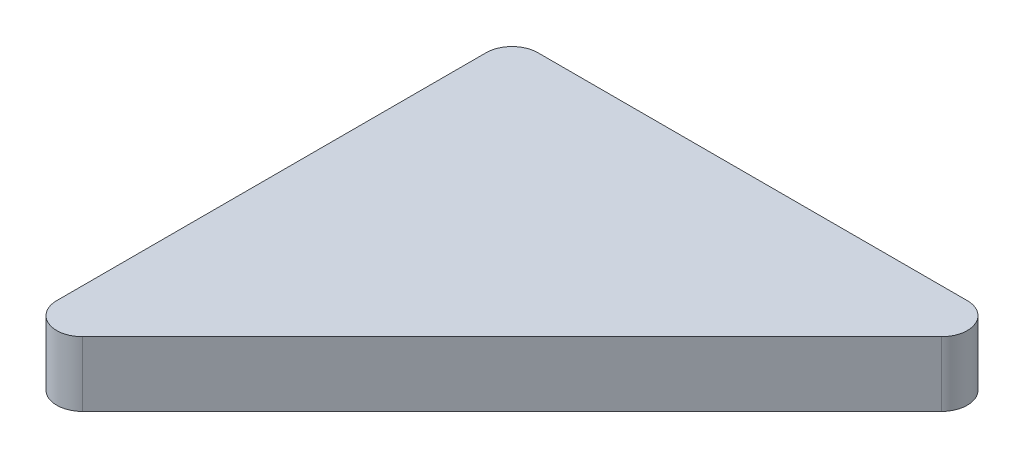
ISO-10303-21;
HEADER;
FILE_DESCRIPTION(('STEP AP214'),'2;1');
FILE_NAME('part.step','',(''),(''),'','','');
FILE_SCHEMA(('AUTOMOTIVE_DESIGN { 1 0 10303 214 1 1 1 1 }'));
ENDSEC;
DATA;
#1=APPLICATION_CONTEXT('core data for automotive mechanical design processes');
#2=APPLICATION_PROTOCOL_DEFINITION('international standard','automotive_design',2000,#1);
#3=PRODUCT_CONTEXT('',#1,'mechanical');
#4=PRODUCT('Part','Part','',(#3));
#5=PRODUCT_RELATED_PRODUCT_CATEGORY('part','',(#4));
#6=PRODUCT_DEFINITION_FORMATION('','',#4);
#7=PRODUCT_DEFINITION_CONTEXT('part definition',#1,'design');
#8=PRODUCT_DEFINITION('design','',#6,#7);
#9=PRODUCT_DEFINITION_SHAPE('','',#8);
#10=(LENGTH_UNIT() NAMED_UNIT(*) SI_UNIT(.MILLI.,.METRE.));
#11=(NAMED_UNIT(*) PLANE_ANGLE_UNIT() SI_UNIT($,.RADIAN.));
#12=(NAMED_UNIT(*) SI_UNIT($,.STERADIAN.) SOLID_ANGLE_UNIT());
#13=UNCERTAINTY_MEASURE_WITH_UNIT(LENGTH_MEASURE(1.E-05),#10,'distance_accuracy_value','');
#14=(GEOMETRIC_REPRESENTATION_CONTEXT(3) GLOBAL_UNCERTAINTY_ASSIGNED_CONTEXT((#13)) GLOBAL_UNIT_ASSIGNED_CONTEXT((#10,
#11,#12)) REPRESENTATION_CONTEXT('',''));
#15=CARTESIAN_POINT('',(0.,0.,0.));
#16=DIRECTION('',(0.,0.,1.));
#17=DIRECTION('',(1.,0.,0.));
#18=AXIS2_PLACEMENT_3D('',#15,#16,#17);
#19=CARTESIAN_POINT('',(-137.11838792952,-40.7775047870634,100.059139431858));
#20=DIRECTION('',(0.,1.,0.));
#21=DIRECTION('',(0.,0.,1.));
#22=AXIS2_PLACEMENT_3D('',#19,#20,#21);
#23=PLANE('',#22);
#24=CARTESIAN_POINT('',(-79.7504903779471,-40.7775047870634,-87.9008605681422));
#25=DIRECTION('',(0.,1.,0.));
#26=DIRECTION('',(0.,0.,1.));
#27=AXIS2_PLACEMENT_3D('',#24,#25,#26);
#28=CIRCLE('',#27,2.54);
#29=CARTESIAN_POINT('',(-77.9544391537333,-40.7775047870634,-86.1048093439283));
#30=VERTEX_POINT('',#29);
#31=CARTESIAN_POINT('',(-79.7504903779471,-40.7775047870634,-90.4408605681422));
#32=VERTEX_POINT('',#31);
#33=EDGE_CURVE('E39',#30,#32,#28,.T.);
#34=ORIENTED_EDGE('',*,*,#33,.F.);
#35=DIRECTION('',(0.707106781186547,0.,-0.707106781186548));
#36=VECTOR('',#35,1.);
#37=CARTESIAN_POINT('',(-120.082336705306,-40.7775047870634,-43.976911792356));
#38=LINE('',#37,#36);
#39=CARTESIAN_POINT('',(-120.082336705306,-40.7775047870634,-43.976911792356));
#40=VERTEX_POINT('',#39);
#41=EDGE_CURVE('E103',#40,#30,#38,.T.);
#42=ORIENTED_EDGE('',*,*,#41,.F.);
#43=CARTESIAN_POINT('',(-121.878387929519,-40.7775047870634,-45.7729630165698));
#44=DIRECTION('',(0.,1.,0.));
#45=DIRECTION('',(0.,0.,-1.));
#46=AXIS2_PLACEMENT_3D('',#43,#44,#45);
#47=CIRCLE('',#46,2.54);
#48=CARTESIAN_POINT('',(-124.418387929519,-40.7775047870634,-45.7729630165699));
#49=VERTEX_POINT('',#48);
#50=EDGE_CURVE('E86',#49,#40,#47,.T.);
#51=ORIENTED_EDGE('',*,*,#50,.F.);
#52=DIRECTION('',(0.,0.,1.));
#53=VECTOR('',#52,1.);
#54=CARTESIAN_POINT('',(-124.418387929519,-40.7775047870634,-87.9008605681421));
#55=LINE('',#54,#53);
#56=CARTESIAN_POINT('',(-124.418387929519,-40.7775047870634,-87.9008605681421));
#57=VERTEX_POINT('',#56);
#58=EDGE_CURVE('E91',#57,#49,#55,.T.);
#59=ORIENTED_EDGE('',*,*,#58,.F.);
#60=CARTESIAN_POINT('',(-121.878387929519,-40.7775047870634,-87.9008605681422));
#61=DIRECTION('',(0.,1.,0.));
#62=DIRECTION('',(0.,0.,-1.));
#63=AXIS2_PLACEMENT_3D('',#60,#61,#62);
#64=CIRCLE('',#63,2.53999999999999);
#65=CARTESIAN_POINT('',(-121.878387929519,-40.7775047870634,-90.4408605681421));
#66=VERTEX_POINT('',#65);
#67=EDGE_CURVE('E110',#66,#57,#64,.T.);
#68=ORIENTED_EDGE('',*,*,#67,.F.);
#69=DIRECTION('',(-1.,0.,0.));
#70=VECTOR('',#69,1.);
#71=CARTESIAN_POINT('',(-121.878387929519,-40.7775047870634,-90.4408605681422));
#72=LINE('',#71,#70);
#73=EDGE_CURVE('E112',#32,#66,#72,.T.);
#74=ORIENTED_EDGE('',*,*,#73,.F.);
#75=EDGE_LOOP('',(#34,#42,#51,#59,#68,#74));
#76=FACE_BOUND('',#75,.T.);
#77=ADVANCED_FACE('F35',(#76),#23,.F.);
#78=CARTESIAN_POINT('',(-121.878387929519,-40.7775047870634,-90.4408605681422));
#79=DIRECTION('',(0.,0.,-1.));
#80=DIRECTION('',(-1.,0.,0.));
#81=AXIS2_PLACEMENT_3D('',#78,#79,#80);
#82=PLANE('',#81);
#83=DIRECTION('',(-1.,0.,0.));
#84=VECTOR('',#83,1.);
#85=CARTESIAN_POINT('',(-121.878387929519,-34.4275047870634,-90.4408605681422));
#86=LINE('',#85,#84);
#87=CARTESIAN_POINT('',(-79.7504903779471,-34.4275047870634,-90.4408605681422));
#88=VERTEX_POINT('',#87);
#89=CARTESIAN_POINT('',(-121.878387929519,-34.4275047870634,-90.4408605681422));
#90=VERTEX_POINT('',#89);
#91=EDGE_CURVE('E134',#88,#90,#86,.T.);
#92=ORIENTED_EDGE('',*,*,#91,.F.);
#93=DIRECTION('',(0.,1.,0.));
#94=VECTOR('',#93,1.);
#95=CARTESIAN_POINT('',(-79.7504903779471,-40.7775047870634,-90.4408605681422));
#96=LINE('',#95,#94);
#97=EDGE_CURVE('E54',#32,#88,#96,.T.);
#98=ORIENTED_EDGE('',*,*,#97,.F.);
#99=ORIENTED_EDGE('',*,*,#73,.T.);
#100=DIRECTION('',(0.,1.,0.));
#101=VECTOR('',#100,1.);
#102=CARTESIAN_POINT('',(-121.878387929519,-40.7775047870634,-90.4408605681422));
#103=LINE('',#102,#101);
#104=EDGE_CURVE('E111',#66,#90,#103,.T.);
#105=ORIENTED_EDGE('',*,*,#104,.T.);
#106=EDGE_LOOP('',(#92,#98,#99,#105));
#107=FACE_BOUND('',#106,.T.);
#108=ADVANCED_FACE('F146',(#107),#82,.T.);
#109=CARTESIAN_POINT('',(-121.878387929519,-40.7775047870634,-87.9008605681422));
#110=DIRECTION('',(0.,1.,0.));
#111=DIRECTION('',(0.,0.,1.));
#112=AXIS2_PLACEMENT_3D('',#109,#110,#111);
#113=CYLINDRICAL_SURFACE('',#112,2.53999999999999);
#114=CARTESIAN_POINT('',(-121.878387929519,-34.4275047870634,-87.9008605681422));
#115=DIRECTION('',(0.,1.,0.));
#116=DIRECTION('',(0.,0.,-1.));
#117=AXIS2_PLACEMENT_3D('',#114,#115,#116);
#118=CIRCLE('',#117,2.53999999999999);
#119=CARTESIAN_POINT('',(-124.418387929519,-34.4275047870634,-87.9008605681421));
#120=VERTEX_POINT('',#119);
#121=EDGE_CURVE('E131',#90,#120,#118,.T.);
#122=ORIENTED_EDGE('',*,*,#121,.F.);
#123=ORIENTED_EDGE('',*,*,#104,.F.);
#124=ORIENTED_EDGE('',*,*,#67,.T.);
#125=DIRECTION('',(0.,1.,0.));
#126=VECTOR('',#125,1.);
#127=CARTESIAN_POINT('',(-124.418387929519,-40.7775047870634,-87.9008605681421));
#128=LINE('',#127,#126);
#129=EDGE_CURVE('E96',#57,#120,#128,.T.);
#130=ORIENTED_EDGE('',*,*,#129,.T.);
#131=EDGE_LOOP('',(#122,#123,#124,#130));
#132=FACE_BOUND('',#131,.T.);
#133=ADVANCED_FACE('F143',(#132),#113,.T.);
#134=CARTESIAN_POINT('',(-124.418387929519,-40.7775047870634,-87.9008605681421));
#135=DIRECTION('',(-1.,0.,0.));
#136=DIRECTION('',(0.,0.,1.));
#137=AXIS2_PLACEMENT_3D('',#134,#135,#136);
#138=PLANE('',#137);
#139=DIRECTION('',(0.,0.,1.));
#140=VECTOR('',#139,1.);
#141=CARTESIAN_POINT('',(-124.418387929519,-34.4275047870634,-87.9008605681421));
#142=LINE('',#141,#140);
#143=CARTESIAN_POINT('',(-124.418387929519,-34.4275047870634,-45.7729630165699));
#144=VERTEX_POINT('',#143);
#145=EDGE_CURVE('E45',#120,#144,#142,.T.);
#146=ORIENTED_EDGE('',*,*,#145,.F.);
#147=ORIENTED_EDGE('',*,*,#129,.F.);
#148=ORIENTED_EDGE('',*,*,#58,.T.);
#149=DIRECTION('',(0.,1.,0.));
#150=VECTOR('',#149,1.);
#151=CARTESIAN_POINT('',(-124.418387929519,-40.7775047870634,-45.7729630165699));
#152=LINE('',#151,#150);
#153=EDGE_CURVE('E82',#49,#144,#152,.T.);
#154=ORIENTED_EDGE('',*,*,#153,.T.);
#155=EDGE_LOOP('',(#146,#147,#148,#154));
#156=FACE_BOUND('',#155,.T.);
#157=ADVANCED_FACE('F95',(#156),#138,.T.);
#158=CARTESIAN_POINT('',(-121.878387929519,-40.7775047870634,-45.7729630165698));
#159=DIRECTION('',(0.,1.,0.));
#160=DIRECTION('',(0.,0.,1.));
#161=AXIS2_PLACEMENT_3D('',#158,#159,#160);
#162=CYLINDRICAL_SURFACE('',#161,2.54);
#163=CARTESIAN_POINT('',(-121.878387929519,-34.4275047870634,-45.7729630165698));
#164=DIRECTION('',(0.,1.,0.));
#165=DIRECTION('',(0.,0.,-1.));
#166=AXIS2_PLACEMENT_3D('',#163,#164,#165);
#167=CIRCLE('',#166,2.54);
#168=CARTESIAN_POINT('',(-120.082336705306,-34.4275047870634,-43.976911792356));
#169=VERTEX_POINT('',#168);
#170=EDGE_CURVE('E11',#144,#169,#167,.T.);
#171=ORIENTED_EDGE('',*,*,#170,.F.);
#172=ORIENTED_EDGE('',*,*,#153,.F.);
#173=ORIENTED_EDGE('',*,*,#50,.T.);
#174=DIRECTION('',(0.,1.,0.));
#175=VECTOR('',#174,1.);
#176=CARTESIAN_POINT('',(-120.082336705306,-40.7775047870634,-43.976911792356));
#177=LINE('',#176,#175);
#178=EDGE_CURVE('E104',#40,#169,#177,.T.);
#179=ORIENTED_EDGE('',*,*,#178,.T.);
#180=EDGE_LOOP('',(#171,#172,#173,#179));
#181=FACE_BOUND('',#180,.T.);
#182=ADVANCED_FACE('F84',(#181),#162,.T.);
#183=CARTESIAN_POINT('',(-120.082336705306,-40.7775047870634,-43.976911792356));
#184=DIRECTION('',(0.707106781186548,0.,0.707106781186547));
#185=DIRECTION('',(0.707106781186547,0.,-0.707106781186548));
#186=AXIS2_PLACEMENT_3D('',#183,#184,#185);
#187=PLANE('',#186);
#188=DIRECTION('',(0.707106781186547,0.,-0.707106781186548));
#189=VECTOR('',#188,1.);
#190=CARTESIAN_POINT('',(-120.082336705306,-34.4275047870634,-43.976911792356));
#191=LINE('',#190,#189);
#192=CARTESIAN_POINT('',(-77.9544391537333,-34.4275047870634,-86.1048093439283));
#193=VERTEX_POINT('',#192);
#194=EDGE_CURVE('E126',#169,#193,#191,.T.);
#195=ORIENTED_EDGE('',*,*,#194,.F.);
#196=ORIENTED_EDGE('',*,*,#178,.F.);
#197=ORIENTED_EDGE('',*,*,#41,.T.);
#198=DIRECTION('',(0.,1.,0.));
#199=VECTOR('',#198,1.);
#200=CARTESIAN_POINT('',(-77.9544391537333,-40.7775047870634,-86.1048093439283));
#201=LINE('',#200,#199);
#202=EDGE_CURVE('E124',#30,#193,#201,.T.);
#203=ORIENTED_EDGE('',*,*,#202,.T.);
#204=EDGE_LOOP('',(#195,#196,#197,#203));
#205=FACE_BOUND('',#204,.T.);
#206=ADVANCED_FACE('F140',(#205),#187,.T.);
#207=CARTESIAN_POINT('',(-79.7504903779471,-40.7775047870634,-87.9008605681422));
#208=DIRECTION('',(0.,1.,0.));
#209=DIRECTION('',(0.,0.,1.));
#210=AXIS2_PLACEMENT_3D('',#207,#208,#209);
#211=CYLINDRICAL_SURFACE('',#210,2.54);
#212=CARTESIAN_POINT('',(-79.7504903779471,-34.4275047870634,-87.9008605681422));
#213=DIRECTION('',(0.,1.,0.));
#214=DIRECTION('',(0.,0.,1.));
#215=AXIS2_PLACEMENT_3D('',#212,#213,#214);
#216=CIRCLE('',#215,2.54);
#217=EDGE_CURVE('E128',#193,#88,#216,.T.);
#218=ORIENTED_EDGE('',*,*,#217,.F.);
#219=ORIENTED_EDGE('',*,*,#202,.F.);
#220=ORIENTED_EDGE('',*,*,#33,.T.);
#221=ORIENTED_EDGE('',*,*,#97,.T.);
#222=EDGE_LOOP('',(#218,#219,#220,#221));
#223=FACE_BOUND('',#222,.T.);
#224=ADVANCED_FACE('F138',(#223),#211,.T.);
#225=CARTESIAN_POINT('',(-137.11838792952,-34.4275047870634,100.059139431858));
#226=DIRECTION('',(0.,1.,0.));
#227=DIRECTION('',(0.,0.,1.));
#228=AXIS2_PLACEMENT_3D('',#225,#226,#227);
#229=PLANE('',#228);
#230=ORIENTED_EDGE('',*,*,#194,.T.);
#231=ORIENTED_EDGE('',*,*,#217,.T.);
#232=ORIENTED_EDGE('',*,*,#91,.T.);
#233=ORIENTED_EDGE('',*,*,#121,.T.);
#234=ORIENTED_EDGE('',*,*,#145,.T.);
#235=ORIENTED_EDGE('',*,*,#170,.T.);
#236=EDGE_LOOP('',(#230,#231,#232,#233,#234,#235));
#237=FACE_BOUND('',#236,.T.);
#238=ADVANCED_FACE('F37',(#237),#229,.T.);
#239=CLOSED_SHELL('',(#77,#108,#133,#157,#182,#206,#224,#238));
#240=MANIFOLD_SOLID_BREP('B2',#239);
#241=ADVANCED_BREP_SHAPE_REPRESENTATION('',(#18,#240),#14);
#242=SHAPE_DEFINITION_REPRESENTATION(#9,#241);
ENDSEC;
END-ISO-10303-21;
